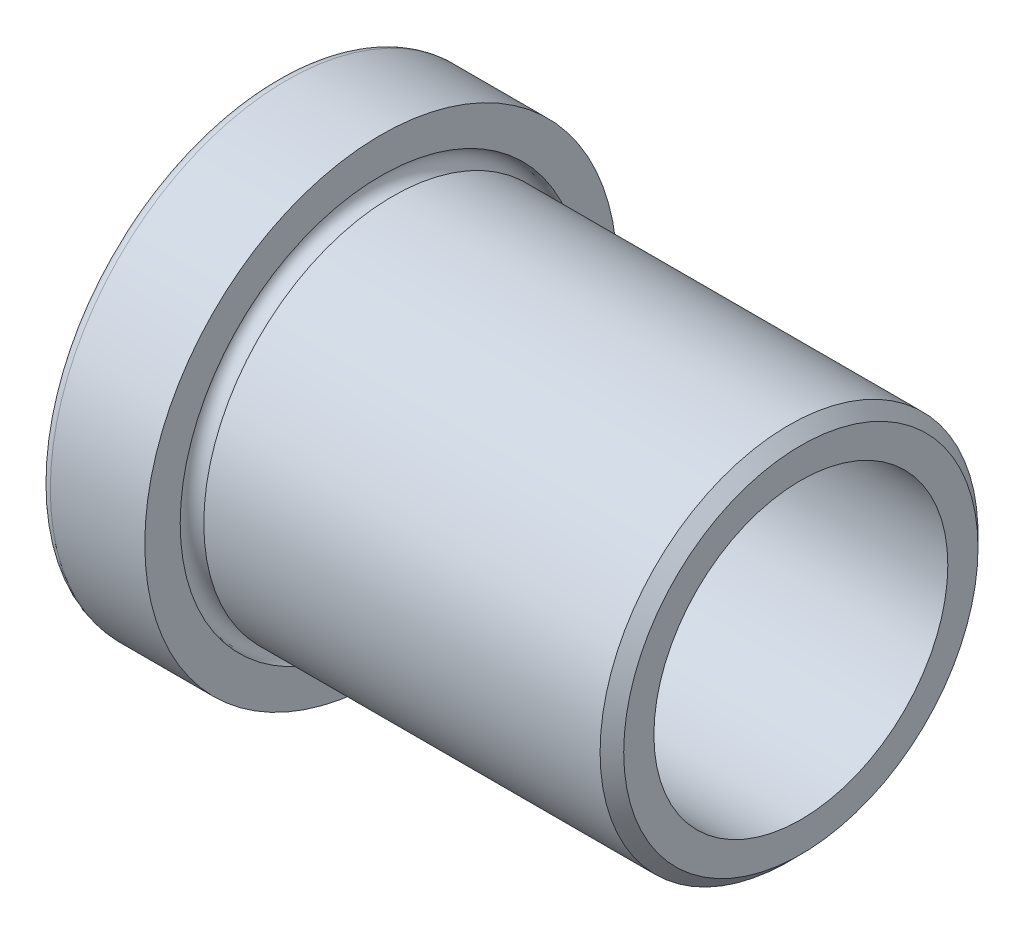
ISO-10303-21;
HEADER;
FILE_DESCRIPTION(('STEP AP214'),'2;1');
FILE_NAME('part.step','',(''),(''),'','','');
FILE_SCHEMA(('AUTOMOTIVE_DESIGN { 1 0 10303 214 1 1 1 1 }'));
ENDSEC;
DATA;
#1=APPLICATION_CONTEXT('core data for automotive mechanical design processes');
#2=APPLICATION_PROTOCOL_DEFINITION('international standard','automotive_design',2000,#1);
#3=PRODUCT_CONTEXT('',#1,'mechanical');
#4=PRODUCT('Part','Part','',(#3));
#5=PRODUCT_RELATED_PRODUCT_CATEGORY('part','',(#4));
#6=PRODUCT_DEFINITION_FORMATION('','',#4);
#7=PRODUCT_DEFINITION_CONTEXT('part definition',#1,'design');
#8=PRODUCT_DEFINITION('design','',#6,#7);
#9=PRODUCT_DEFINITION_SHAPE('','',#8);
#10=(LENGTH_UNIT() NAMED_UNIT(*) SI_UNIT(.MILLI.,.METRE.));
#11=(NAMED_UNIT(*) PLANE_ANGLE_UNIT() SI_UNIT($,.RADIAN.));
#12=(NAMED_UNIT(*) SI_UNIT($,.STERADIAN.) SOLID_ANGLE_UNIT());
#13=UNCERTAINTY_MEASURE_WITH_UNIT(LENGTH_MEASURE(1.E-05),#10,'distance_accuracy_value','');
#14=(GEOMETRIC_REPRESENTATION_CONTEXT(3) GLOBAL_UNCERTAINTY_ASSIGNED_CONTEXT((#13)) GLOBAL_UNIT_ASSIGNED_CONTEXT((#10,
#11,#12)) REPRESENTATION_CONTEXT('',''));
#15=CARTESIAN_POINT('',(0.,0.,0.));
#16=DIRECTION('',(0.,0.,1.));
#17=DIRECTION('',(1.,0.,0.));
#18=AXIS2_PLACEMENT_3D('',#15,#16,#17);
#19=CARTESIAN_POINT('',(15.875,35.7124,0.));
#20=DIRECTION('',(1.,0.,0.));
#21=DIRECTION('',(0.,0.,-1.));
#22=AXIS2_PLACEMENT_3D('',#19,#20,#21);
#23=PLANE('',#22);
#24=CARTESIAN_POINT('',(15.875,0.,0.));
#25=DIRECTION('',(-1.,0.,0.));
#26=DIRECTION('',(0.,0.,1.));
#27=AXIS2_PLACEMENT_3D('',#24,#25,#26);
#28=CIRCLE('',#27,30.35935);
#29=CARTESIAN_POINT('',(15.875,0.,30.35935));
#30=VERTEX_POINT('',#29);
#31=EDGE_CURVE('E64',#30,#30,#28,.T.);
#32=ORIENTED_EDGE('',*,*,#31,.T.);
#33=EDGE_LOOP('',(#32));
#34=FACE_BOUND('',#33,.T.);
#35=CARTESIAN_POINT('',(15.875,0.,0.));
#36=DIRECTION('',(-1.,0.,0.));
#37=DIRECTION('',(0.,0.,1.));
#38=AXIS2_PLACEMENT_3D('',#35,#36,#37);
#39=CIRCLE('',#38,35.7124);
#40=CARTESIAN_POINT('',(15.875,0.,35.7124));
#41=VERTEX_POINT('',#40);
#42=EDGE_CURVE('E10',#41,#41,#39,.T.);
#43=ORIENTED_EDGE('',*,*,#42,.F.);
#44=EDGE_LOOP('',(#43));
#45=FACE_BOUND('',#44,.T.);
#46=ADVANCED_FACE('F30',(#34,#45),#23,.T.);
#47=CARTESIAN_POINT('',(0.,0.,0.));
#48=DIRECTION('',(-1.,0.,0.));
#49=DIRECTION('',(0.,0.,1.));
#50=AXIS2_PLACEMENT_3D('',#47,#48,#49);
#51=CYLINDRICAL_SURFACE('',#50,35.7124);
#52=ORIENTED_EDGE('',*,*,#42,.T.);
#53=EDGE_LOOP('',(#52));
#54=FACE_BOUND('',#53,.T.);
#55=CARTESIAN_POINT('',(1.5875,0.,0.));
#56=DIRECTION('',(-1.,0.,0.));
#57=DIRECTION('',(0.,0.,1.));
#58=AXIS2_PLACEMENT_3D('',#55,#56,#57);
#59=CIRCLE('',#58,35.7124);
#60=CARTESIAN_POINT('',(1.5875,0.,35.7124));
#61=VERTEX_POINT('',#60);
#62=EDGE_CURVE('E36',#61,#61,#59,.T.);
#63=ORIENTED_EDGE('',*,*,#62,.F.);
#64=EDGE_LOOP('',(#63));
#65=FACE_BOUND('',#64,.T.);
#66=ADVANCED_FACE('F82',(#54,#65),#51,.T.);
#67=CARTESIAN_POINT('',(1.5875,0.,0.));
#68=DIRECTION('',(-1.,0.,0.));
#69=DIRECTION('',(0.,0.,1.));
#70=AXIS2_PLACEMENT_3D('',#67,#68,#69);
#71=TOROIDAL_SURFACE('',#70,34.1249,1.5875);
#72=CARTESIAN_POINT('',(0.,0.,0.));
#73=DIRECTION('',(-1.,0.,0.));
#74=DIRECTION('',(0.,0.,1.));
#75=AXIS2_PLACEMENT_3D('',#72,#73,#74);
#76=CIRCLE('',#75,34.1249);
#77=CARTESIAN_POINT('',(0.,0.,34.1249));
#78=VERTEX_POINT('',#77);
#79=EDGE_CURVE('E40',#78,#78,#76,.T.);
#80=ORIENTED_EDGE('',*,*,#79,.F.);
#81=EDGE_LOOP('',(#80));
#82=FACE_BOUND('',#81,.T.);
#83=ORIENTED_EDGE('',*,*,#62,.T.);
#84=EDGE_LOOP('',(#83));
#85=FACE_BOUND('',#84,.T.);
#86=ADVANCED_FACE('F86',(#82,#85),#71,.T.);
#87=CARTESIAN_POINT('',(0.,25.4,0.));
#88=DIRECTION('',(-1.,0.,0.));
#89=DIRECTION('',(0.,0.,1.));
#90=AXIS2_PLACEMENT_3D('',#87,#88,#89);
#91=PLANE('',#90);
#92=ORIENTED_EDGE('',*,*,#79,.T.);
#93=EDGE_LOOP('',(#92));
#94=FACE_BOUND('',#93,.T.);
#95=CARTESIAN_POINT('',(0.,0.,0.));
#96=DIRECTION('',(-1.,0.,0.));
#97=DIRECTION('',(0.,0.,1.));
#98=AXIS2_PLACEMENT_3D('',#95,#96,#97);
#99=CIRCLE('',#98,25.4);
#100=CARTESIAN_POINT('',(0.,0.,25.4));
#101=VERTEX_POINT('',#100);
#102=EDGE_CURVE('E44',#101,#101,#99,.T.);
#103=ORIENTED_EDGE('',*,*,#102,.F.);
#104=EDGE_LOOP('',(#103));
#105=FACE_BOUND('',#104,.T.);
#106=ADVANCED_FACE('F90',(#94,#105),#91,.T.);
#107=CARTESIAN_POINT('',(3.175,0.,0.));
#108=DIRECTION('',(-1.,0.,0.));
#109=DIRECTION('',(0.,0.,1.));
#110=AXIS2_PLACEMENT_3D('',#107,#108,#109);
#111=TOROIDAL_SURFACE('',#110,25.4,3.175);
#112=CARTESIAN_POINT('',(3.175,0.,0.));
#113=DIRECTION('',(-1.,0.,0.));
#114=DIRECTION('',(0.,0.,1.));
#115=AXIS2_PLACEMENT_3D('',#112,#113,#114);
#116=CIRCLE('',#115,22.225);
#117=CARTESIAN_POINT('',(3.175,0.,22.225));
#118=VERTEX_POINT('',#117);
#119=EDGE_CURVE('E49',#118,#118,#116,.T.);
#120=ORIENTED_EDGE('',*,*,#119,.F.);
#121=EDGE_LOOP('',(#120));
#122=FACE_BOUND('',#121,.T.);
#123=ORIENTED_EDGE('',*,*,#102,.T.);
#124=EDGE_LOOP('',(#123));
#125=FACE_BOUND('',#124,.T.);
#126=ADVANCED_FACE('F97',(#122,#125),#111,.T.);
#127=CARTESIAN_POINT('',(0.,0.,0.));
#128=DIRECTION('',(-1.,0.,0.));
#129=DIRECTION('',(0.,0.,1.));
#130=AXIS2_PLACEMENT_3D('',#127,#128,#129);
#131=CYLINDRICAL_SURFACE('',#130,22.225);
#132=ORIENTED_EDGE('',*,*,#119,.T.);
#133=EDGE_LOOP('',(#132));
#134=FACE_BOUND('',#133,.T.);
#135=CARTESIAN_POINT('',(79.375,0.,0.));
#136=DIRECTION('',(-1.,0.,0.));
#137=DIRECTION('',(0.,0.,1.));
#138=AXIS2_PLACEMENT_3D('',#135,#136,#137);
#139=CIRCLE('',#138,22.225);
#140=CARTESIAN_POINT('',(79.375,0.,22.225));
#141=VERTEX_POINT('',#140);
#142=EDGE_CURVE('E52',#141,#141,#139,.T.);
#143=ORIENTED_EDGE('',*,*,#142,.F.);
#144=EDGE_LOOP('',(#143));
#145=FACE_BOUND('',#144,.T.);
#146=ADVANCED_FACE('F101',(#134,#145),#131,.F.);
#147=CARTESIAN_POINT('',(79.375,26.7890625,0.));
#148=DIRECTION('',(1.,0.,0.));
#149=DIRECTION('',(0.,0.,-1.));
#150=AXIS2_PLACEMENT_3D('',#147,#148,#149);
#151=PLANE('',#150);
#152=ORIENTED_EDGE('',*,*,#142,.T.);
#153=EDGE_LOOP('',(#152));
#154=FACE_BOUND('',#153,.T.);
#155=CARTESIAN_POINT('',(79.375,0.,0.));
#156=DIRECTION('',(-1.,0.,0.));
#157=DIRECTION('',(0.,0.,1.));
#158=AXIS2_PLACEMENT_3D('',#155,#156,#157);
#159=CIRCLE('',#158,26.7890625);
#160=CARTESIAN_POINT('',(79.375,0.,26.7890625));
#161=VERTEX_POINT('',#160);
#162=EDGE_CURVE('E55',#161,#161,#159,.T.);
#163=ORIENTED_EDGE('',*,*,#162,.F.);
#164=EDGE_LOOP('',(#163));
#165=FACE_BOUND('',#164,.T.);
#166=ADVANCED_FACE('F105',(#154,#165),#151,.T.);
#167=CARTESIAN_POINT('',(77.5890625,0.,0.));
#168=DIRECTION('',(-1.,0.,0.));
#169=DIRECTION('',(0.,0.,1.));
#170=AXIS2_PLACEMENT_3D('',#167,#168,#169);
#171=CONICAL_SURFACE('',#170,28.575,0.785398163397439);
#172=ORIENTED_EDGE('',*,*,#162,.T.);
#173=EDGE_LOOP('',(#172));
#174=FACE_BOUND('',#173,.T.);
#175=CARTESIAN_POINT('',(77.5890625,0.,0.));
#176=DIRECTION('',(-1.,0.,0.));
#177=DIRECTION('',(0.,0.,1.));
#178=AXIS2_PLACEMENT_3D('',#175,#176,#177);
#179=CIRCLE('',#178,28.575);
#180=CARTESIAN_POINT('',(77.5890625,0.,28.575));
#181=VERTEX_POINT('',#180);
#182=EDGE_CURVE('E58',#181,#181,#179,.T.);
#183=ORIENTED_EDGE('',*,*,#182,.F.);
#184=EDGE_LOOP('',(#183));
#185=FACE_BOUND('',#184,.T.);
#186=ADVANCED_FACE('F78',(#174,#185),#171,.T.);
#187=CARTESIAN_POINT('',(0.,0.,0.));
#188=DIRECTION('',(-1.,0.,0.));
#189=DIRECTION('',(0.,0.,1.));
#190=AXIS2_PLACEMENT_3D('',#187,#188,#189);
#191=CYLINDRICAL_SURFACE('',#190,28.575);
#192=ORIENTED_EDGE('',*,*,#182,.T.);
#193=EDGE_LOOP('',(#192));
#194=FACE_BOUND('',#193,.T.);
#195=CARTESIAN_POINT('',(17.65935,0.,0.));
#196=DIRECTION('',(-1.,0.,0.));
#197=DIRECTION('',(0.,0.,1.));
#198=AXIS2_PLACEMENT_3D('',#195,#196,#197);
#199=CIRCLE('',#198,28.575);
#200=CARTESIAN_POINT('',(17.65935,0.,28.575));
#201=VERTEX_POINT('',#200);
#202=EDGE_CURVE('E61',#201,#201,#199,.T.);
#203=ORIENTED_EDGE('',*,*,#202,.F.);
#204=EDGE_LOOP('',(#203));
#205=FACE_BOUND('',#204,.T.);
#206=ADVANCED_FACE('F72',(#194,#205),#191,.T.);
#207=CARTESIAN_POINT('',(15.875,0.,0.));
#208=DIRECTION('',(-1.,0.,0.));
#209=DIRECTION('',(0.,0.,1.));
#210=AXIS2_PLACEMENT_3D('',#207,#208,#209);
#211=TOROIDAL_SURFACE('',#210,28.575,1.78435);
#212=ORIENTED_EDGE('',*,*,#202,.T.);
#213=EDGE_LOOP('',(#212));
#214=FACE_BOUND('',#213,.T.);
#215=ORIENTED_EDGE('',*,*,#31,.F.);
#216=EDGE_LOOP('',(#215));
#217=FACE_BOUND('',#216,.T.);
#218=ADVANCED_FACE('F70',(#214,#217),#211,.F.);
#219=CLOSED_SHELL('',(#46,#66,#86,#106,#126,#146,#166,#186,#206,#218));
#220=MANIFOLD_SOLID_BREP('B2',#219);
#221=ADVANCED_BREP_SHAPE_REPRESENTATION('',(#18,#220),#14);
#222=SHAPE_DEFINITION_REPRESENTATION(#9,#221);
ENDSEC;
END-ISO-10303-21;
